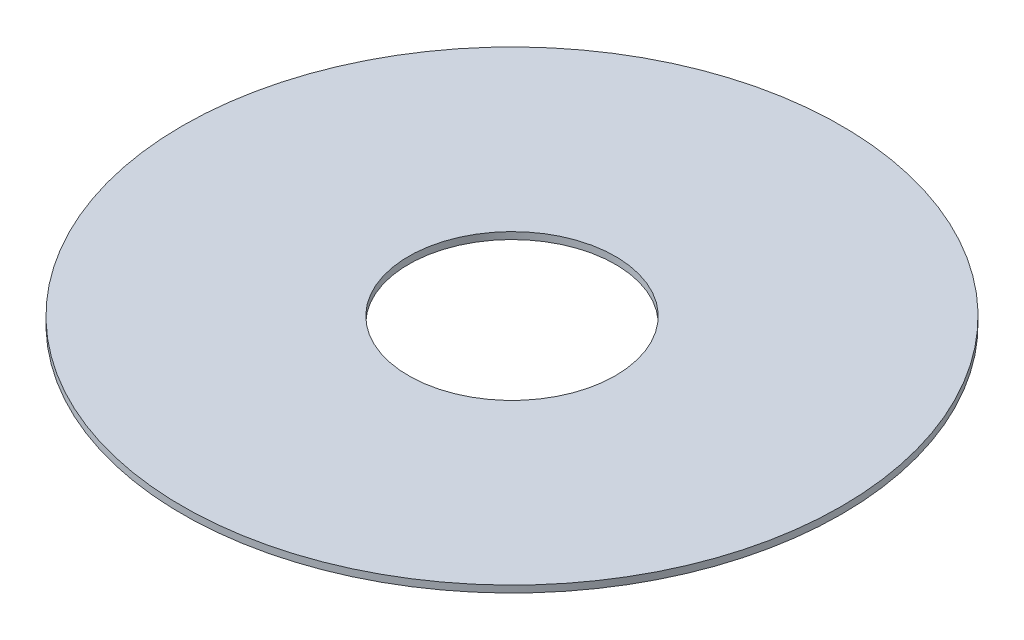
ISO-10303-21;
HEADER;
FILE_DESCRIPTION(('STEP AP214'),'2;1');
FILE_NAME('part.step','',(''),(''),'','','');
FILE_SCHEMA(('AUTOMOTIVE_DESIGN { 1 0 10303 214 1 1 1 1 }'));
ENDSEC;
DATA;
#1=APPLICATION_CONTEXT('core data for automotive mechanical design processes');
#2=APPLICATION_PROTOCOL_DEFINITION('international standard','automotive_design',2000,#1);
#3=PRODUCT_CONTEXT('',#1,'mechanical');
#4=PRODUCT('Part','Part','',(#3));
#5=PRODUCT_RELATED_PRODUCT_CATEGORY('part','',(#4));
#6=PRODUCT_DEFINITION_FORMATION('','',#4);
#7=PRODUCT_DEFINITION_CONTEXT('part definition',#1,'design');
#8=PRODUCT_DEFINITION('design','',#6,#7);
#9=PRODUCT_DEFINITION_SHAPE('','',#8);
#10=(LENGTH_UNIT() NAMED_UNIT(*) SI_UNIT(.MILLI.,.METRE.));
#11=(NAMED_UNIT(*) PLANE_ANGLE_UNIT() SI_UNIT($,.RADIAN.));
#12=(NAMED_UNIT(*) SI_UNIT($,.STERADIAN.) SOLID_ANGLE_UNIT());
#13=UNCERTAINTY_MEASURE_WITH_UNIT(LENGTH_MEASURE(1.E-05),#10,'distance_accuracy_value','');
#14=(GEOMETRIC_REPRESENTATION_CONTEXT(3) GLOBAL_UNCERTAINTY_ASSIGNED_CONTEXT((#13)) GLOBAL_UNIT_ASSIGNED_CONTEXT((#10,
#11,#12)) REPRESENTATION_CONTEXT('',''));
#15=CARTESIAN_POINT('',(0.,0.,0.));
#16=DIRECTION('',(0.,0.,1.));
#17=DIRECTION('',(1.,0.,0.));
#18=AXIS2_PLACEMENT_3D('',#15,#16,#17);
#19=CARTESIAN_POINT('',(0.,-201.6,0.));
#20=DIRECTION('',(0.,1.,0.));
#21=DIRECTION('',(1.,0.,0.));
#22=AXIS2_PLACEMENT_3D('',#19,#20,#21);
#23=PLANE('',#22);
#24=CARTESIAN_POINT('',(0.,-201.6,0.));
#25=DIRECTION('',(0.,-1.,0.));
#26=DIRECTION('',(-1.,0.,0.));
#27=AXIS2_PLACEMENT_3D('',#24,#25,#26);
#28=CIRCLE('',#27,75.);
#29=CARTESIAN_POINT('',(75.,-201.6,0.));
#30=VERTEX_POINT('',#29);
#31=EDGE_CURVE('E74',#30,#30,#28,.T.);
#32=ORIENTED_EDGE('',*,*,#31,.F.);
#33=EDGE_LOOP('',(#32));
#34=FACE_BOUND('',#33,.T.);
#35=DIRECTION('',(0.,0.,1.));
#36=VECTOR('',#35,1.);
#37=CARTESIAN_POINT('',(208.663226576422,-201.6,-0.0500000000000024));
#38=LINE('',#37,#36);
#39=CARTESIAN_POINT('',(208.663226576422,-201.6,-0.100000000000005));
#40=VERTEX_POINT('',#39);
#41=CARTESIAN_POINT('',(208.663226576422,-201.6,0.0999999999999952));
#42=VERTEX_POINT('',#41);
#43=EDGE_CURVE('E127',#40,#42,#38,.T.);
#44=ORIENTED_EDGE('',*,*,#43,.T.);
#45=DIRECTION('',(1.,0.,0.));
#46=VECTOR('',#45,1.);
#47=CARTESIAN_POINT('',(104.331613288211,-201.6,0.0999999999999952));
#48=LINE('',#47,#46);
#49=CARTESIAN_POINT('',(228.663226576422,-201.6,0.0999999999999952));
#50=VERTEX_POINT('',#49);
#51=EDGE_CURVE('E108',#42,#50,#48,.T.);
#52=ORIENTED_EDGE('',*,*,#51,.T.);
#53=DIRECTION('',(0.,0.,-1.));
#54=VECTOR('',#53,1.);
#55=CARTESIAN_POINT('',(228.663226576422,-201.6,0.0499999999999976));
#56=LINE('',#55,#54);
#57=CARTESIAN_POINT('',(228.663226576422,-201.6,-0.100000000000005));
#58=VERTEX_POINT('',#57);
#59=EDGE_CURVE('E133',#50,#58,#56,.T.);
#60=ORIENTED_EDGE('',*,*,#59,.T.);
#61=DIRECTION('',(-1.,0.,0.));
#62=VECTOR('',#61,1.);
#63=CARTESIAN_POINT('',(114.331613288211,-201.6,-0.100000000000005));
#64=LINE('',#63,#62);
#65=EDGE_CURVE('E117',#58,#40,#64,.T.);
#66=ORIENTED_EDGE('',*,*,#65,.T.);
#67=EDGE_LOOP('',(#44,#52,#60,#66));
#68=FACE_BOUND('',#67,.T.);
#69=CARTESIAN_POINT('',(0.,-201.6,0.));
#70=DIRECTION('',(0.,1.,0.));
#71=DIRECTION('',(-1.,0.,0.));
#72=AXIS2_PLACEMENT_3D('',#69,#70,#71);
#73=CIRCLE('',#72,239.);
#74=CARTESIAN_POINT('',(239.,-201.6,0.));
#75=VERTEX_POINT('',#74);
#76=EDGE_CURVE('E11',#75,#75,#73,.T.);
#77=ORIENTED_EDGE('',*,*,#76,.F.);
#78=EDGE_LOOP('',(#77));
#79=FACE_BOUND('',#78,.T.);
#80=ADVANCED_FACE('F17',(#34,#68,#79),#23,.F.);
#81=CARTESIAN_POINT('',(0.,-196.6,0.));
#82=DIRECTION('',(0.,1.,0.));
#83=DIRECTION('',(1.,0.,0.));
#84=AXIS2_PLACEMENT_3D('',#81,#82,#83);
#85=PLANE('',#84);
#86=CARTESIAN_POINT('',(0.,-196.6,0.));
#87=DIRECTION('',(0.,-1.,0.));
#88=DIRECTION('',(-1.,0.,0.));
#89=AXIS2_PLACEMENT_3D('',#86,#87,#88);
#90=CIRCLE('',#89,75.);
#91=CARTESIAN_POINT('',(75.,-196.6,0.));
#92=VERTEX_POINT('',#91);
#93=EDGE_CURVE('E107',#92,#92,#90,.T.);
#94=ORIENTED_EDGE('',*,*,#93,.T.);
#95=EDGE_LOOP('',(#94));
#96=FACE_BOUND('',#95,.T.);
#97=CARTESIAN_POINT('',(0.,-196.6,0.));
#98=DIRECTION('',(0.,1.,0.));
#99=DIRECTION('',(-1.,0.,0.));
#100=AXIS2_PLACEMENT_3D('',#97,#98,#99);
#101=CIRCLE('',#100,239.);
#102=CARTESIAN_POINT('',(239.,-196.6,0.));
#103=VERTEX_POINT('',#102);
#104=EDGE_CURVE('E140',#103,#103,#101,.T.);
#105=ORIENTED_EDGE('',*,*,#104,.T.);
#106=EDGE_LOOP('',(#105));
#107=FACE_BOUND('',#106,.T.);
#108=ADVANCED_FACE('F19',(#96,#107),#85,.T.);
#109=CARTESIAN_POINT('',(0.,-201.6,0.));
#110=DIRECTION('',(0.,1.,0.));
#111=DIRECTION('',(-1.,0.,0.));
#112=AXIS2_PLACEMENT_3D('',#109,#110,#111);
#113=CYLINDRICAL_SURFACE('',#112,239.);
#114=ORIENTED_EDGE('',*,*,#104,.F.);
#115=DIRECTION('',(0.,-1.,0.));
#116=VECTOR('',#115,1.);
#117=CARTESIAN_POINT('',(239.,-201.6,0.));
#118=LINE('',#117,#116);
#119=EDGE_CURVE('E27',#103,#75,#118,.T.);
#120=ORIENTED_EDGE('',*,*,#119,.T.);
#121=ORIENTED_EDGE('',*,*,#76,.T.);
#122=ORIENTED_EDGE('',*,*,#119,.F.);
#123=EDGE_LOOP('',(#114,#120,#121,#122));
#124=FACE_BOUND('',#123,.T.);
#125=ADVANCED_FACE('F161',(#124),#113,.T.);
#126=CARTESIAN_POINT('',(0.,-201.6,0.));
#127=DIRECTION('',(0.,1.,0.));
#128=DIRECTION('',(-1.,0.,0.));
#129=AXIS2_PLACEMENT_3D('',#126,#127,#128);
#130=CYLINDRICAL_SURFACE('',#129,75.);
#131=ORIENTED_EDGE('',*,*,#93,.F.);
#132=DIRECTION('',(0.,-1.,0.));
#133=VECTOR('',#132,1.);
#134=CARTESIAN_POINT('',(75.,-201.6,0.));
#135=LINE('',#134,#133);
#136=EDGE_CURVE('E66',#92,#30,#135,.T.);
#137=ORIENTED_EDGE('',*,*,#136,.T.);
#138=ORIENTED_EDGE('',*,*,#31,.T.);
#139=ORIENTED_EDGE('',*,*,#136,.F.);
#140=EDGE_LOOP('',(#131,#137,#138,#139));
#141=FACE_BOUND('',#140,.T.);
#142=ADVANCED_FACE('F157',(#141),#130,.F.);
#143=CARTESIAN_POINT('',(218.663226576422,-201.4,0.));
#144=DIRECTION('',(0.,1.,0.));
#145=DIRECTION('',(1.,0.,0.));
#146=AXIS2_PLACEMENT_3D('',#143,#144,#145);
#147=PLANE('',#146);
#148=DIRECTION('',(1.,0.,0.));
#149=VECTOR('',#148,1.);
#150=CARTESIAN_POINT('',(208.663226576422,-201.4,0.0999999999999952));
#151=LINE('',#150,#149);
#152=CARTESIAN_POINT('',(208.663226576422,-201.4,0.0999999999999952));
#153=VERTEX_POINT('',#152);
#154=CARTESIAN_POINT('',(228.663226576422,-201.4,0.0999999999999952));
#155=VERTEX_POINT('',#154);
#156=EDGE_CURVE('E96',#153,#155,#151,.T.);
#157=ORIENTED_EDGE('',*,*,#156,.F.);
#158=DIRECTION('',(0.,0.,1.));
#159=VECTOR('',#158,1.);
#160=CARTESIAN_POINT('',(208.663226576422,-201.4,-0.100000000000005));
#161=LINE('',#160,#159);
#162=CARTESIAN_POINT('',(208.663226576422,-201.4,-0.100000000000005));
#163=VERTEX_POINT('',#162);
#164=EDGE_CURVE('E100',#163,#153,#161,.T.);
#165=ORIENTED_EDGE('',*,*,#164,.F.);
#166=DIRECTION('',(-1.,0.,0.));
#167=VECTOR('',#166,1.);
#168=CARTESIAN_POINT('',(228.663226576422,-201.4,-0.100000000000005));
#169=LINE('',#168,#167);
#170=CARTESIAN_POINT('',(228.663226576422,-201.4,-0.100000000000005));
#171=VERTEX_POINT('',#170);
#172=EDGE_CURVE('E90',#171,#163,#169,.T.);
#173=ORIENTED_EDGE('',*,*,#172,.F.);
#174=DIRECTION('',(0.,0.,-1.));
#175=VECTOR('',#174,1.);
#176=CARTESIAN_POINT('',(228.663226576422,-201.4,0.0999999999999952));
#177=LINE('',#176,#175);
#178=EDGE_CURVE('E102',#155,#171,#177,.T.);
#179=ORIENTED_EDGE('',*,*,#178,.F.);
#180=EDGE_LOOP('',(#157,#165,#173,#179));
#181=FACE_BOUND('',#180,.T.);
#182=ADVANCED_FACE('F98',(#181),#147,.F.);
#183=CARTESIAN_POINT('',(208.663226576422,-201.6,0.0999999999999952));
#184=DIRECTION('',(0.,0.,1.));
#185=DIRECTION('',(1.,0.,0.));
#186=AXIS2_PLACEMENT_3D('',#183,#184,#185);
#187=PLANE('',#186);
#188=ORIENTED_EDGE('',*,*,#51,.F.);
#189=DIRECTION('',(0.,1.,0.));
#190=VECTOR('',#189,1.);
#191=CARTESIAN_POINT('',(208.663226576422,-201.6,0.0999999999999952));
#192=LINE('',#191,#190);
#193=EDGE_CURVE('E111',#42,#153,#192,.T.);
#194=ORIENTED_EDGE('',*,*,#193,.T.);
#195=ORIENTED_EDGE('',*,*,#156,.T.);
#196=DIRECTION('',(0.,1.,0.));
#197=VECTOR('',#196,1.);
#198=CARTESIAN_POINT('',(228.663226576422,-201.6,0.0999999999999952));
#199=LINE('',#198,#197);
#200=EDGE_CURVE('E132',#50,#155,#199,.T.);
#201=ORIENTED_EDGE('',*,*,#200,.F.);
#202=EDGE_LOOP('',(#188,#194,#195,#201));
#203=FACE_BOUND('',#202,.T.);
#204=ADVANCED_FACE('F112',(#203),#187,.F.);
#205=CARTESIAN_POINT('',(228.663226576422,-201.6,0.0999999999999952));
#206=DIRECTION('',(1.,0.,0.));
#207=DIRECTION('',(0.,1.,0.));
#208=AXIS2_PLACEMENT_3D('',#205,#206,#207);
#209=PLANE('',#208);
#210=ORIENTED_EDGE('',*,*,#59,.F.);
#211=ORIENTED_EDGE('',*,*,#200,.T.);
#212=ORIENTED_EDGE('',*,*,#178,.T.);
#213=DIRECTION('',(0.,1.,0.));
#214=VECTOR('',#213,1.);
#215=CARTESIAN_POINT('',(228.663226576422,-201.6,-0.100000000000005));
#216=LINE('',#215,#214);
#217=EDGE_CURVE('E137',#58,#171,#216,.T.);
#218=ORIENTED_EDGE('',*,*,#217,.F.);
#219=EDGE_LOOP('',(#210,#211,#212,#218));
#220=FACE_BOUND('',#219,.T.);
#221=ADVANCED_FACE('F177',(#220),#209,.F.);
#222=CARTESIAN_POINT('',(228.663226576422,-201.6,-0.100000000000005));
#223=DIRECTION('',(0.,0.,-1.));
#224=DIRECTION('',(0.,-1.,0.));
#225=AXIS2_PLACEMENT_3D('',#222,#223,#224);
#226=PLANE('',#225);
#227=ORIENTED_EDGE('',*,*,#65,.F.);
#228=ORIENTED_EDGE('',*,*,#217,.T.);
#229=ORIENTED_EDGE('',*,*,#172,.T.);
#230=DIRECTION('',(0.,1.,0.));
#231=VECTOR('',#230,1.);
#232=CARTESIAN_POINT('',(208.663226576422,-201.6,-0.100000000000005));
#233=LINE('',#232,#231);
#234=EDGE_CURVE('E120',#40,#163,#233,.T.);
#235=ORIENTED_EDGE('',*,*,#234,.F.);
#236=EDGE_LOOP('',(#227,#228,#229,#235));
#237=FACE_BOUND('',#236,.T.);
#238=ADVANCED_FACE('F201',(#237),#226,.F.);
#239=CARTESIAN_POINT('',(208.663226576422,-201.6,-0.100000000000005));
#240=DIRECTION('',(-1.,0.,0.));
#241=DIRECTION('',(0.,0.,1.));
#242=AXIS2_PLACEMENT_3D('',#239,#240,#241);
#243=PLANE('',#242);
#244=ORIENTED_EDGE('',*,*,#43,.F.);
#245=ORIENTED_EDGE('',*,*,#234,.T.);
#246=ORIENTED_EDGE('',*,*,#164,.T.);
#247=ORIENTED_EDGE('',*,*,#193,.F.);
#248=EDGE_LOOP('',(#244,#245,#246,#247));
#249=FACE_BOUND('',#248,.T.);
#250=ADVANCED_FACE('F119',(#249),#243,.F.);
#251=CLOSED_SHELL('',(#80,#108,#125,#142,#182,#204,#221,#238,#250));
#252=MANIFOLD_SOLID_BREP('B1',#251);
#253=ADVANCED_BREP_SHAPE_REPRESENTATION('',(#18,#252),#14);
#254=SHAPE_DEFINITION_REPRESENTATION(#9,#253);
ENDSEC;
END-ISO-10303-21;
